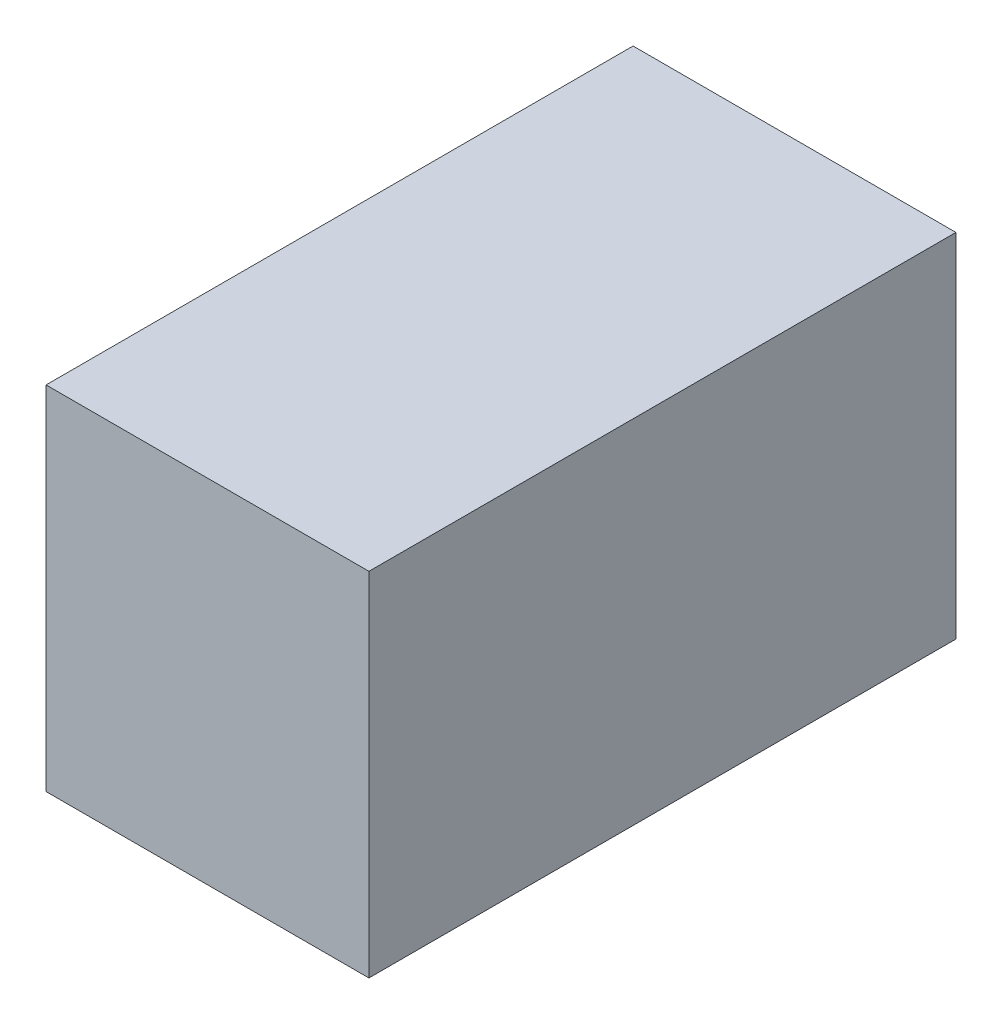
ISO-10303-21;
HEADER;
FILE_DESCRIPTION(('STEP AP214'),'2;1');
FILE_NAME('part.step','',(''),(''),'','','');
FILE_SCHEMA(('AUTOMOTIVE_DESIGN { 1 0 10303 214 1 1 1 1 }'));
ENDSEC;
DATA;
#1=APPLICATION_CONTEXT('core data for automotive mechanical design processes');
#2=APPLICATION_PROTOCOL_DEFINITION('international standard','automotive_design',2000,#1);
#3=PRODUCT_CONTEXT('',#1,'mechanical');
#4=PRODUCT('Part','Part','',(#3));
#5=PRODUCT_RELATED_PRODUCT_CATEGORY('part','',(#4));
#6=PRODUCT_DEFINITION_FORMATION('','',#4);
#7=PRODUCT_DEFINITION_CONTEXT('part definition',#1,'design');
#8=PRODUCT_DEFINITION('design','',#6,#7);
#9=PRODUCT_DEFINITION_SHAPE('','',#8);
#10=(LENGTH_UNIT() NAMED_UNIT(*) SI_UNIT(.MILLI.,.METRE.));
#11=(NAMED_UNIT(*) PLANE_ANGLE_UNIT() SI_UNIT($,.RADIAN.));
#12=(NAMED_UNIT(*) SI_UNIT($,.STERADIAN.) SOLID_ANGLE_UNIT());
#13=UNCERTAINTY_MEASURE_WITH_UNIT(LENGTH_MEASURE(1.E-05),#10,'distance_accuracy_value','');
#14=(GEOMETRIC_REPRESENTATION_CONTEXT(3) GLOBAL_UNCERTAINTY_ASSIGNED_CONTEXT((#13)) GLOBAL_UNIT_ASSIGNED_CONTEXT((#10,
#11,#12)) REPRESENTATION_CONTEXT('',''));
#15=CARTESIAN_POINT('',(0.,0.,0.));
#16=DIRECTION('',(0.,0.,1.));
#17=DIRECTION('',(1.,0.,0.));
#18=AXIS2_PLACEMENT_3D('',#15,#16,#17);
#19=CARTESIAN_POINT('',(-5.49999999999999,12.,10.));
#20=DIRECTION('',(1.,0.,0.));
#21=DIRECTION('',(0.,0.,-1.));
#22=AXIS2_PLACEMENT_3D('',#19,#20,#21);
#23=PLANE('',#22);
#24=DIRECTION('',(0.,0.,1.));
#25=VECTOR('',#24,1.);
#26=CARTESIAN_POINT('',(-5.49999999999999,0.,10.));
#27=LINE('',#26,#25);
#28=CARTESIAN_POINT('',(-5.49999999999999,0.,-10.));
#29=VERTEX_POINT('',#28);
#30=CARTESIAN_POINT('',(-5.49999999999999,0.,10.));
#31=VERTEX_POINT('',#30);
#32=EDGE_CURVE('E107',#29,#31,#27,.T.);
#33=ORIENTED_EDGE('',*,*,#32,.T.);
#34=DIRECTION('',(0.,-1.,0.));
#35=VECTOR('',#34,1.);
#36=CARTESIAN_POINT('',(-5.49999999999999,12.,10.));
#37=LINE('',#36,#35);
#38=CARTESIAN_POINT('',(-5.49999999999999,12.,10.));
#39=VERTEX_POINT('',#38);
#40=EDGE_CURVE('E11',#39,#31,#37,.T.);
#41=ORIENTED_EDGE('',*,*,#40,.F.);
#42=DIRECTION('',(0.,0.,1.));
#43=VECTOR('',#42,1.);
#44=CARTESIAN_POINT('',(-5.49999999999999,12.,10.));
#45=LINE('',#44,#43);
#46=CARTESIAN_POINT('',(-5.49999999999999,12.,-10.));
#47=VERTEX_POINT('',#46);
#48=EDGE_CURVE('E91',#47,#39,#45,.T.);
#49=ORIENTED_EDGE('',*,*,#48,.F.);
#50=DIRECTION('',(0.,-1.,0.));
#51=VECTOR('',#50,1.);
#52=CARTESIAN_POINT('',(-5.49999999999999,12.,-10.));
#53=LINE('',#52,#51);
#54=EDGE_CURVE('E103',#47,#29,#53,.T.);
#55=ORIENTED_EDGE('',*,*,#54,.T.);
#56=EDGE_LOOP('',(#33,#41,#49,#55));
#57=FACE_BOUND('',#56,.T.);
#58=ADVANCED_FACE('F39',(#57),#23,.F.);
#59=CARTESIAN_POINT('',(5.50000000000001,12.,10.));
#60=DIRECTION('',(0.,0.,-1.));
#61=DIRECTION('',(-1.,0.,0.));
#62=AXIS2_PLACEMENT_3D('',#59,#60,#61);
#63=PLANE('',#62);
#64=DIRECTION('',(1.,0.,0.));
#65=VECTOR('',#64,1.);
#66=CARTESIAN_POINT('',(5.50000000000001,0.,10.));
#67=LINE('',#66,#65);
#68=CARTESIAN_POINT('',(5.50000000000001,0.,10.));
#69=VERTEX_POINT('',#68);
#70=EDGE_CURVE('E96',#31,#69,#67,.T.);
#71=ORIENTED_EDGE('',*,*,#70,.T.);
#72=DIRECTION('',(0.,-1.,0.));
#73=VECTOR('',#72,1.);
#74=CARTESIAN_POINT('',(5.50000000000001,12.,10.));
#75=LINE('',#74,#73);
#76=CARTESIAN_POINT('',(5.50000000000001,12.,10.));
#77=VERTEX_POINT('',#76);
#78=EDGE_CURVE('E48',#77,#69,#75,.T.);
#79=ORIENTED_EDGE('',*,*,#78,.F.);
#80=DIRECTION('',(1.,0.,0.));
#81=VECTOR('',#80,1.);
#82=CARTESIAN_POINT('',(5.50000000000001,12.,10.));
#83=LINE('',#82,#81);
#84=EDGE_CURVE('E86',#39,#77,#83,.T.);
#85=ORIENTED_EDGE('',*,*,#84,.F.);
#86=ORIENTED_EDGE('',*,*,#40,.T.);
#87=EDGE_LOOP('',(#71,#79,#85,#86));
#88=FACE_BOUND('',#87,.T.);
#89=ADVANCED_FACE('F95',(#88),#63,.F.);
#90=CARTESIAN_POINT('',(5.50000000000001,12.,10.));
#91=DIRECTION('',(-1.,0.,0.));
#92=DIRECTION('',(0.,0.,1.));
#93=AXIS2_PLACEMENT_3D('',#90,#91,#92);
#94=PLANE('',#93);
#95=DIRECTION('',(0.,0.,-1.));
#96=VECTOR('',#95,1.);
#97=CARTESIAN_POINT('',(5.50000000000001,0.,10.));
#98=LINE('',#97,#96);
#99=CARTESIAN_POINT('',(5.50000000000001,0.,-10.));
#100=VERTEX_POINT('',#99);
#101=EDGE_CURVE('E73',#69,#100,#98,.T.);
#102=ORIENTED_EDGE('',*,*,#101,.T.);
#103=DIRECTION('',(0.,-1.,0.));
#104=VECTOR('',#103,1.);
#105=CARTESIAN_POINT('',(5.50000000000001,12.,-10.));
#106=LINE('',#105,#104);
#107=CARTESIAN_POINT('',(5.50000000000001,12.,-10.));
#108=VERTEX_POINT('',#107);
#109=EDGE_CURVE('E98',#108,#100,#106,.T.);
#110=ORIENTED_EDGE('',*,*,#109,.F.);
#111=DIRECTION('',(0.,0.,-1.));
#112=VECTOR('',#111,1.);
#113=CARTESIAN_POINT('',(5.50000000000001,12.,10.));
#114=LINE('',#113,#112);
#115=EDGE_CURVE('E89',#77,#108,#114,.T.);
#116=ORIENTED_EDGE('',*,*,#115,.F.);
#117=ORIENTED_EDGE('',*,*,#78,.T.);
#118=EDGE_LOOP('',(#102,#110,#116,#117));
#119=FACE_BOUND('',#118,.T.);
#120=ADVANCED_FACE('F99',(#119),#94,.F.);
#121=CARTESIAN_POINT('',(5.50000000000001,12.,-10.));
#122=DIRECTION('',(0.,0.,1.));
#123=DIRECTION('',(1.,0.,0.));
#124=AXIS2_PLACEMENT_3D('',#121,#122,#123);
#125=PLANE('',#124);
#126=DIRECTION('',(-1.,0.,0.));
#127=VECTOR('',#126,1.);
#128=CARTESIAN_POINT('',(5.50000000000001,0.,-10.));
#129=LINE('',#128,#127);
#130=EDGE_CURVE('E79',#100,#29,#129,.T.);
#131=ORIENTED_EDGE('',*,*,#130,.T.);
#132=ORIENTED_EDGE('',*,*,#54,.F.);
#133=DIRECTION('',(-1.,0.,0.));
#134=VECTOR('',#133,1.);
#135=CARTESIAN_POINT('',(5.50000000000001,12.,-10.));
#136=LINE('',#135,#134);
#137=EDGE_CURVE('E56',#108,#47,#136,.T.);
#138=ORIENTED_EDGE('',*,*,#137,.F.);
#139=ORIENTED_EDGE('',*,*,#109,.T.);
#140=EDGE_LOOP('',(#131,#132,#138,#139));
#141=FACE_BOUND('',#140,.T.);
#142=ADVANCED_FACE('F120',(#141),#125,.F.);
#143=CARTESIAN_POINT('',(0.,12.,0.));
#144=DIRECTION('',(0.,1.,0.));
#145=DIRECTION('',(0.,0.,1.));
#146=AXIS2_PLACEMENT_3D('',#143,#144,#145);
#147=PLANE('',#146);
#148=ORIENTED_EDGE('',*,*,#48,.T.);
#149=ORIENTED_EDGE('',*,*,#84,.T.);
#150=ORIENTED_EDGE('',*,*,#115,.T.);
#151=ORIENTED_EDGE('',*,*,#137,.T.);
#152=EDGE_LOOP('',(#148,#149,#150,#151));
#153=FACE_BOUND('',#152,.T.);
#154=ADVANCED_FACE('F87',(#153),#147,.T.);
#155=CARTESIAN_POINT('',(0.,0.,0.));
#156=DIRECTION('',(0.,1.,0.));
#157=DIRECTION('',(0.,0.,1.));
#158=AXIS2_PLACEMENT_3D('',#155,#156,#157);
#159=PLANE('',#158);
#160=ORIENTED_EDGE('',*,*,#32,.F.);
#161=ORIENTED_EDGE('',*,*,#130,.F.);
#162=ORIENTED_EDGE('',*,*,#101,.F.);
#163=ORIENTED_EDGE('',*,*,#70,.F.);
#164=EDGE_LOOP('',(#160,#161,#162,#163));
#165=FACE_BOUND('',#164,.T.);
#166=ADVANCED_FACE('F123',(#165),#159,.F.);
#167=CLOSED_SHELL('',(#58,#89,#120,#142,#154,#166));
#168=MANIFOLD_SOLID_BREP('B2',#167);
#169=ADVANCED_BREP_SHAPE_REPRESENTATION('',(#18,#168),#14);
#170=SHAPE_DEFINITION_REPRESENTATION(#9,#169);
ENDSEC;
END-ISO-10303-21;
